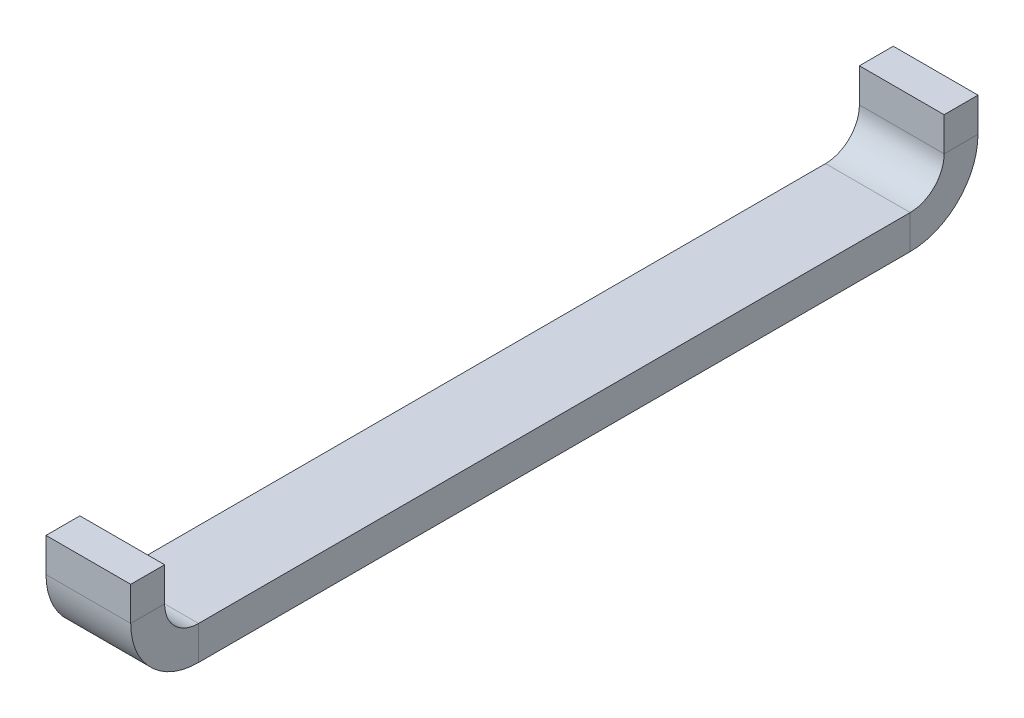
ISO-10303-21;
HEADER;
FILE_DESCRIPTION(('STEP AP214'),'2;1');
FILE_NAME('part.step','',(''),(''),'','','');
FILE_SCHEMA(('AUTOMOTIVE_DESIGN { 1 0 10303 214 1 1 1 1 }'));
ENDSEC;
DATA;
#1=APPLICATION_CONTEXT('core data for automotive mechanical design processes');
#2=APPLICATION_PROTOCOL_DEFINITION('international standard','automotive_design',2000,#1);
#3=PRODUCT_CONTEXT('',#1,'mechanical');
#4=PRODUCT('Part','Part','',(#3));
#5=PRODUCT_RELATED_PRODUCT_CATEGORY('part','',(#4));
#6=PRODUCT_DEFINITION_FORMATION('','',#4);
#7=PRODUCT_DEFINITION_CONTEXT('part definition',#1,'design');
#8=PRODUCT_DEFINITION('design','',#6,#7);
#9=PRODUCT_DEFINITION_SHAPE('','',#8);
#10=(LENGTH_UNIT() NAMED_UNIT(*) SI_UNIT(.MILLI.,.METRE.));
#11=(NAMED_UNIT(*) PLANE_ANGLE_UNIT() SI_UNIT($,.RADIAN.));
#12=(NAMED_UNIT(*) SI_UNIT($,.STERADIAN.) SOLID_ANGLE_UNIT());
#13=UNCERTAINTY_MEASURE_WITH_UNIT(LENGTH_MEASURE(1.E-05),#10,'distance_accuracy_value','');
#14=(GEOMETRIC_REPRESENTATION_CONTEXT(3) GLOBAL_UNCERTAINTY_ASSIGNED_CONTEXT((#13)) GLOBAL_UNIT_ASSIGNED_CONTEXT((#10,
#11,#12)) REPRESENTATION_CONTEXT('',''));
#15=CARTESIAN_POINT('',(0.,0.,0.));
#16=DIRECTION('',(0.,0.,1.));
#17=DIRECTION('',(1.,0.,0.));
#18=AXIS2_PLACEMENT_3D('',#15,#16,#17);
#19=CARTESIAN_POINT('',(0.,-2.,0.));
#20=DIRECTION('',(0.,-1.,0.));
#21=DIRECTION('',(0.,0.,-1.));
#22=AXIS2_PLACEMENT_3D('',#19,#20,#21);
#23=PLANE('',#22);
#24=DIRECTION('',(0.,0.,1.));
#25=VECTOR('',#24,1.);
#26=CARTESIAN_POINT('',(0.,-2.,0.));
#27=LINE('',#26,#25);
#28=CARTESIAN_POINT('',(0.,-2.00000000000002,-46.));
#29=VERTEX_POINT('',#28);
#30=CARTESIAN_POINT('',(0.,-2.,-4.));
#31=VERTEX_POINT('',#30);
#32=EDGE_CURVE('E84',#29,#31,#27,.T.);
#33=ORIENTED_EDGE('',*,*,#32,.F.);
#34=DIRECTION('',(-1.,0.,0.));
#35=VECTOR('',#34,1.);
#36=CARTESIAN_POINT('',(0.,-2.00000000000002,-46.));
#37=LINE('',#36,#35);
#38=CARTESIAN_POINT('',(5.,-2.,-46.));
#39=VERTEX_POINT('',#38);
#40=EDGE_CURVE('E207',#29,#39,#37,.F.);
#41=ORIENTED_EDGE('',*,*,#40,.T.);
#42=DIRECTION('',(0.,0.,-1.));
#43=VECTOR('',#42,1.);
#44=CARTESIAN_POINT('',(5.,-2.,0.));
#45=LINE('',#44,#43);
#46=CARTESIAN_POINT('',(5.,-2.00000000000001,-4.));
#47=VERTEX_POINT('',#46);
#48=EDGE_CURVE('E13',#47,#39,#45,.T.);
#49=ORIENTED_EDGE('',*,*,#48,.F.);
#50=DIRECTION('',(1.,0.,0.));
#51=VECTOR('',#50,1.);
#52=CARTESIAN_POINT('',(5.,-2.00000000000001,-4.));
#53=LINE('',#52,#51);
#54=EDGE_CURVE('E258',#47,#31,#53,.F.);
#55=ORIENTED_EDGE('',*,*,#54,.T.);
#56=EDGE_LOOP('',(#33,#41,#49,#55));
#57=FACE_BOUND('',#56,.T.);
#58=ADVANCED_FACE('F75',(#57),#23,.T.);
#59=CARTESIAN_POINT('',(0.,0.,0.));
#60=DIRECTION('',(0.,-1.,0.));
#61=DIRECTION('',(0.,0.,-1.));
#62=AXIS2_PLACEMENT_3D('',#59,#60,#61);
#63=PLANE('',#62);
#64=DIRECTION('',(-1.,0.,0.));
#65=VECTOR('',#64,1.);
#66=CARTESIAN_POINT('',(0.,0.,-46.));
#67=LINE('',#66,#65);
#68=CARTESIAN_POINT('',(0.,0.,-46.));
#69=VERTEX_POINT('',#68);
#70=CARTESIAN_POINT('',(5.,0.,-46.));
#71=VERTEX_POINT('',#70);
#72=EDGE_CURVE('E218',#69,#71,#67,.F.);
#73=ORIENTED_EDGE('',*,*,#72,.F.);
#74=DIRECTION('',(0.,0.,1.));
#75=VECTOR('',#74,1.);
#76=CARTESIAN_POINT('',(0.,0.,0.));
#77=LINE('',#76,#75);
#78=CARTESIAN_POINT('',(0.,0.,-4.));
#79=VERTEX_POINT('',#78);
#80=EDGE_CURVE('E275',#69,#79,#77,.T.);
#81=ORIENTED_EDGE('',*,*,#80,.T.);
#82=DIRECTION('',(1.,0.,0.));
#83=VECTOR('',#82,1.);
#84=CARTESIAN_POINT('',(5.,0.,-4.));
#85=LINE('',#84,#83);
#86=CARTESIAN_POINT('',(5.,0.,-4.));
#87=VERTEX_POINT('',#86);
#88=EDGE_CURVE('E269',#87,#79,#85,.F.);
#89=ORIENTED_EDGE('',*,*,#88,.F.);
#90=DIRECTION('',(0.,0.,-1.));
#91=VECTOR('',#90,1.);
#92=CARTESIAN_POINT('',(5.,0.,0.));
#93=LINE('',#92,#91);
#94=EDGE_CURVE('E79',#87,#71,#93,.T.);
#95=ORIENTED_EDGE('',*,*,#94,.T.);
#96=EDGE_LOOP('',(#73,#81,#89,#95));
#97=FACE_BOUND('',#96,.T.);
#98=ADVANCED_FACE('F287',(#97),#63,.F.);
#99=CARTESIAN_POINT('',(0.,-2.,0.));
#100=DIRECTION('',(-1.,0.,0.));
#101=DIRECTION('',(0.,0.,1.));
#102=AXIS2_PLACEMENT_3D('',#99,#100,#101);
#103=PLANE('',#102);
#104=ORIENTED_EDGE('',*,*,#80,.F.);
#105=DIRECTION('',(0.,-1.,0.));
#106=VECTOR('',#105,1.);
#107=CARTESIAN_POINT('',(0.,0.,-46.));
#108=LINE('',#107,#106);
#109=EDGE_CURVE('E212',#69,#29,#108,.T.);
#110=ORIENTED_EDGE('',*,*,#109,.T.);
#111=ORIENTED_EDGE('',*,*,#32,.T.);
#112=DIRECTION('',(0.,-1.,0.));
#113=VECTOR('',#112,1.);
#114=CARTESIAN_POINT('',(0.,0.,-4.));
#115=LINE('',#114,#113);
#116=EDGE_CURVE('E273',#79,#31,#115,.T.);
#117=ORIENTED_EDGE('',*,*,#116,.F.);
#118=EDGE_LOOP('',(#104,#110,#111,#117));
#119=FACE_BOUND('',#118,.T.);
#120=ADVANCED_FACE('F77',(#119),#103,.T.);
#121=CARTESIAN_POINT('',(5.,-2.,0.));
#122=DIRECTION('',(1.,0.,0.));
#123=DIRECTION('',(0.,0.,-1.));
#124=AXIS2_PLACEMENT_3D('',#121,#122,#123);
#125=PLANE('',#124);
#126=DIRECTION('',(0.,-1.,0.));
#127=VECTOR('',#126,1.);
#128=CARTESIAN_POINT('',(5.,0.,-46.));
#129=LINE('',#128,#127);
#130=EDGE_CURVE('E223',#71,#39,#129,.T.);
#131=ORIENTED_EDGE('',*,*,#130,.F.);
#132=ORIENTED_EDGE('',*,*,#94,.F.);
#133=DIRECTION('',(0.,-1.,0.));
#134=VECTOR('',#133,1.);
#135=CARTESIAN_POINT('',(5.,0.,-4.));
#136=LINE('',#135,#134);
#137=EDGE_CURVE('E263',#87,#47,#136,.T.);
#138=ORIENTED_EDGE('',*,*,#137,.T.);
#139=ORIENTED_EDGE('',*,*,#48,.T.);
#140=EDGE_LOOP('',(#131,#132,#138,#139));
#141=FACE_BOUND('',#140,.T.);
#142=ADVANCED_FACE('F290',(#141),#125,.T.);
#143=CARTESIAN_POINT('',(0.,1.99999999999999,-4.));
#144=DIRECTION('',(-1.,0.,0.));
#145=DIRECTION('',(0.,0.,1.));
#146=AXIS2_PLACEMENT_3D('',#143,#144,#145);
#147=PLANE('',#146);
#148=DIRECTION('',(0.,0.,-1.));
#149=VECTOR('',#148,1.);
#150=CARTESIAN_POINT('',(0.,1.99999999999999,0.));
#151=LINE('',#150,#149);
#152=CARTESIAN_POINT('',(0.,1.99999999999999,-2.));
#153=VERTEX_POINT('',#152);
#154=CARTESIAN_POINT('',(0.,1.99999999999999,0.));
#155=VERTEX_POINT('',#154);
#156=EDGE_CURVE('E225',#153,#155,#151,.F.);
#157=ORIENTED_EDGE('',*,*,#156,.F.);
#158=CARTESIAN_POINT('',(0.,1.99999999999999,-4.));
#159=DIRECTION('',(1.,0.,0.));
#160=DIRECTION('',(0.,0.,-1.));
#161=AXIS2_PLACEMENT_3D('',#158,#159,#160);
#162=CIRCLE('',#161,2.);
#163=EDGE_CURVE('E266',#79,#153,#162,.F.);
#164=ORIENTED_EDGE('',*,*,#163,.F.);
#165=ORIENTED_EDGE('',*,*,#116,.T.);
#166=CARTESIAN_POINT('',(0.,1.99999999999999,-4.));
#167=DIRECTION('',(1.,0.,0.));
#168=DIRECTION('',(0.,0.,-1.));
#169=AXIS2_PLACEMENT_3D('',#166,#167,#168);
#170=CIRCLE('',#169,4.);
#171=EDGE_CURVE('E92',#31,#155,#170,.F.);
#172=ORIENTED_EDGE('',*,*,#171,.T.);
#173=EDGE_LOOP('',(#157,#164,#165,#172));
#174=FACE_BOUND('',#173,.T.);
#175=ADVANCED_FACE('F305',(#174),#147,.T.);
#176=CARTESIAN_POINT('',(5.,1.99999999999999,-4.));
#177=DIRECTION('',(-1.,0.,0.));
#178=DIRECTION('',(0.,0.,1.));
#179=AXIS2_PLACEMENT_3D('',#176,#177,#178);
#180=PLANE('',#179);
#181=CARTESIAN_POINT('',(5.,1.99999999999999,-4.));
#182=DIRECTION('',(1.,0.,0.));
#183=DIRECTION('',(0.,0.,-1.));
#184=AXIS2_PLACEMENT_3D('',#181,#182,#183);
#185=CIRCLE('',#184,2.);
#186=CARTESIAN_POINT('',(5.,1.99999999999999,-2.));
#187=VERTEX_POINT('',#186);
#188=EDGE_CURVE('E231',#187,#87,#185,.T.);
#189=ORIENTED_EDGE('',*,*,#188,.F.);
#190=DIRECTION('',(0.,0.,-1.));
#191=VECTOR('',#190,1.);
#192=CARTESIAN_POINT('',(5.,1.99999999999999,-1.99999999999999));
#193=LINE('',#192,#191);
#194=CARTESIAN_POINT('',(5.,1.99999999999999,0.));
#195=VERTEX_POINT('',#194);
#196=EDGE_CURVE('E251',#187,#195,#193,.F.);
#197=ORIENTED_EDGE('',*,*,#196,.T.);
#198=CARTESIAN_POINT('',(5.,1.99999999999999,-4.));
#199=DIRECTION('',(1.,0.,0.));
#200=DIRECTION('',(0.,0.,-1.));
#201=AXIS2_PLACEMENT_3D('',#198,#199,#200);
#202=CIRCLE('',#201,4.);
#203=EDGE_CURVE('E261',#195,#47,#202,.T.);
#204=ORIENTED_EDGE('',*,*,#203,.T.);
#205=ORIENTED_EDGE('',*,*,#137,.F.);
#206=EDGE_LOOP('',(#189,#197,#204,#205));
#207=FACE_BOUND('',#206,.T.);
#208=ADVANCED_FACE('F329',(#207),#180,.F.);
#209=CARTESIAN_POINT('',(5.,1.99999999999999,-4.));
#210=DIRECTION('',(1.,0.,0.));
#211=DIRECTION('',(0.,0.,1.));
#212=AXIS2_PLACEMENT_3D('',#209,#210,#211);
#213=CYLINDRICAL_SURFACE('',#212,4.);
#214=ORIENTED_EDGE('',*,*,#54,.F.);
#215=ORIENTED_EDGE('',*,*,#203,.F.);
#216=DIRECTION('',(1.,0.,0.));
#217=VECTOR('',#216,1.);
#218=CARTESIAN_POINT('',(0.,1.99999999999999,0.));
#219=LINE('',#218,#217);
#220=EDGE_CURVE('E249',#195,#155,#219,.F.);
#221=ORIENTED_EDGE('',*,*,#220,.T.);
#222=ORIENTED_EDGE('',*,*,#171,.F.);
#223=EDGE_LOOP('',(#214,#215,#221,#222));
#224=FACE_BOUND('',#223,.T.);
#225=ADVANCED_FACE('F332',(#224),#213,.T.);
#226=CARTESIAN_POINT('',(5.,1.99999999999999,-4.));
#227=DIRECTION('',(1.,0.,0.));
#228=DIRECTION('',(0.,0.,1.));
#229=AXIS2_PLACEMENT_3D('',#226,#227,#228);
#230=CYLINDRICAL_SURFACE('',#229,2.);
#231=ORIENTED_EDGE('',*,*,#88,.T.);
#232=ORIENTED_EDGE('',*,*,#163,.T.);
#233=DIRECTION('',(1.,0.,0.));
#234=VECTOR('',#233,1.);
#235=CARTESIAN_POINT('',(0.,1.99999999999999,-2.));
#236=LINE('',#235,#234);
#237=EDGE_CURVE('E254',#153,#187,#236,.T.);
#238=ORIENTED_EDGE('',*,*,#237,.T.);
#239=ORIENTED_EDGE('',*,*,#188,.T.);
#240=EDGE_LOOP('',(#231,#232,#238,#239));
#241=FACE_BOUND('',#240,.T.);
#242=ADVANCED_FACE('F308',(#241),#230,.F.);
#243=CARTESIAN_POINT('',(0.,0.,0.));
#244=DIRECTION('',(1.,0.,0.));
#245=DIRECTION('',(0.,0.,-1.));
#246=AXIS2_PLACEMENT_3D('',#243,#244,#245);
#247=PLANE('',#246);
#248=ORIENTED_EDGE('',*,*,#156,.T.);
#249=DIRECTION('',(0.,-1.,0.));
#250=VECTOR('',#249,1.);
#251=CARTESIAN_POINT('',(0.,0.,0.));
#252=LINE('',#251,#250);
#253=CARTESIAN_POINT('',(0.,4.00000000000001,0.));
#254=VERTEX_POINT('',#253);
#255=EDGE_CURVE('E239',#254,#155,#252,.T.);
#256=ORIENTED_EDGE('',*,*,#255,.F.);
#257=DIRECTION('',(0.,0.,-1.));
#258=VECTOR('',#257,1.);
#259=CARTESIAN_POINT('',(0.,4.00000000000001,0.));
#260=LINE('',#259,#258);
#261=CARTESIAN_POINT('',(0.,4.00000000000001,-2.));
#262=VERTEX_POINT('',#261);
#263=EDGE_CURVE('E232',#254,#262,#260,.T.);
#264=ORIENTED_EDGE('',*,*,#263,.T.);
#265=DIRECTION('',(0.,1.,0.));
#266=VECTOR('',#265,1.);
#267=CARTESIAN_POINT('',(0.,0.,-2.));
#268=LINE('',#267,#266);
#269=EDGE_CURVE('E246',#262,#153,#268,.F.);
#270=ORIENTED_EDGE('',*,*,#269,.T.);
#271=EDGE_LOOP('',(#248,#256,#264,#270));
#272=FACE_BOUND('',#271,.T.);
#273=ADVANCED_FACE('F316',(#272),#247,.F.);
#274=CARTESIAN_POINT('',(5.,4.00000000000001,0.));
#275=DIRECTION('',(-1.,0.,0.));
#276=DIRECTION('',(0.,0.,1.));
#277=AXIS2_PLACEMENT_3D('',#274,#275,#276);
#278=PLANE('',#277);
#279=ORIENTED_EDGE('',*,*,#196,.F.);
#280=DIRECTION('',(0.,-1.,0.));
#281=VECTOR('',#280,1.);
#282=CARTESIAN_POINT('',(5.,4.00000000000001,-2.));
#283=LINE('',#282,#281);
#284=CARTESIAN_POINT('',(5.,4.00000000000001,-2.));
#285=VERTEX_POINT('',#284);
#286=EDGE_CURVE('E244',#187,#285,#283,.F.);
#287=ORIENTED_EDGE('',*,*,#286,.T.);
#288=DIRECTION('',(0.,0.,-1.));
#289=VECTOR('',#288,1.);
#290=CARTESIAN_POINT('',(5.,4.00000000000001,0.));
#291=LINE('',#290,#289);
#292=CARTESIAN_POINT('',(5.,4.00000000000001,0.));
#293=VERTEX_POINT('',#292);
#294=EDGE_CURVE('E228',#293,#285,#291,.T.);
#295=ORIENTED_EDGE('',*,*,#294,.F.);
#296=DIRECTION('',(0.,1.,0.));
#297=VECTOR('',#296,1.);
#298=CARTESIAN_POINT('',(5.,0.,0.));
#299=LINE('',#298,#297);
#300=EDGE_CURVE('E237',#195,#293,#299,.T.);
#301=ORIENTED_EDGE('',*,*,#300,.F.);
#302=EDGE_LOOP('',(#279,#287,#295,#301));
#303=FACE_BOUND('',#302,.T.);
#304=ADVANCED_FACE('F326',(#303),#278,.F.);
#305=CARTESIAN_POINT('',(0.,0.,0.));
#306=DIRECTION('',(0.,0.,-1.));
#307=DIRECTION('',(-1.,0.,0.));
#308=AXIS2_PLACEMENT_3D('',#305,#306,#307);
#309=PLANE('',#308);
#310=ORIENTED_EDGE('',*,*,#220,.F.);
#311=ORIENTED_EDGE('',*,*,#300,.T.);
#312=DIRECTION('',(-1.,0.,0.));
#313=VECTOR('',#312,1.);
#314=CARTESIAN_POINT('',(0.,4.00000000000001,0.));
#315=LINE('',#314,#313);
#316=EDGE_CURVE('E235',#293,#254,#315,.T.);
#317=ORIENTED_EDGE('',*,*,#316,.T.);
#318=ORIENTED_EDGE('',*,*,#255,.T.);
#319=EDGE_LOOP('',(#310,#311,#317,#318));
#320=FACE_BOUND('',#319,.T.);
#321=ADVANCED_FACE('F331',(#320),#309,.F.);
#322=CARTESIAN_POINT('',(0.,0.,-2.));
#323=DIRECTION('',(0.,0.,-1.));
#324=DIRECTION('',(-1.,0.,0.));
#325=AXIS2_PLACEMENT_3D('',#322,#323,#324);
#326=PLANE('',#325);
#327=ORIENTED_EDGE('',*,*,#286,.F.);
#328=ORIENTED_EDGE('',*,*,#237,.F.);
#329=ORIENTED_EDGE('',*,*,#269,.F.);
#330=DIRECTION('',(1.,0.,0.));
#331=VECTOR('',#330,1.);
#332=CARTESIAN_POINT('',(0.,4.00000000000001,-2.));
#333=LINE('',#332,#331);
#334=EDGE_CURVE('E242',#285,#262,#333,.F.);
#335=ORIENTED_EDGE('',*,*,#334,.F.);
#336=EDGE_LOOP('',(#327,#328,#329,#335));
#337=FACE_BOUND('',#336,.T.);
#338=ADVANCED_FACE('F313',(#337),#326,.T.);
#339=CARTESIAN_POINT('',(0.,4.00000000000001,0.));
#340=DIRECTION('',(0.,-1.,0.));
#341=DIRECTION('',(0.,0.,-1.));
#342=AXIS2_PLACEMENT_3D('',#339,#340,#341);
#343=PLANE('',#342);
#344=ORIENTED_EDGE('',*,*,#334,.T.);
#345=ORIENTED_EDGE('',*,*,#263,.F.);
#346=ORIENTED_EDGE('',*,*,#316,.F.);
#347=ORIENTED_EDGE('',*,*,#294,.T.);
#348=EDGE_LOOP('',(#344,#345,#346,#347));
#349=FACE_BOUND('',#348,.T.);
#350=ADVANCED_FACE('F321',(#349),#343,.F.);
#351=CARTESIAN_POINT('',(5.,1.99999999999998,-46.));
#352=DIRECTION('',(1.,0.,0.));
#353=DIRECTION('',(0.,0.,-1.));
#354=AXIS2_PLACEMENT_3D('',#351,#352,#353);
#355=PLANE('',#354);
#356=DIRECTION('',(0.,0.,1.));
#357=VECTOR('',#356,1.);
#358=CARTESIAN_POINT('',(5.,2.00000000000001,-50.));
#359=LINE('',#358,#357);
#360=CARTESIAN_POINT('',(5.,1.99999999999997,-48.));
#361=VERTEX_POINT('',#360);
#362=CARTESIAN_POINT('',(5.,1.99999999999997,-50.));
#363=VERTEX_POINT('',#362);
#364=EDGE_CURVE('E190',#361,#363,#359,.F.);
#365=ORIENTED_EDGE('',*,*,#364,.F.);
#366=CARTESIAN_POINT('',(5.,1.99999999999998,-46.));
#367=DIRECTION('',(-1.,0.,0.));
#368=DIRECTION('',(0.,0.,1.));
#369=AXIS2_PLACEMENT_3D('',#366,#367,#368);
#370=CIRCLE('',#369,2.);
#371=EDGE_CURVE('E215',#71,#361,#370,.F.);
#372=ORIENTED_EDGE('',*,*,#371,.F.);
#373=ORIENTED_EDGE('',*,*,#130,.T.);
#374=CARTESIAN_POINT('',(5.,1.99999999999998,-46.));
#375=DIRECTION('',(-1.,0.,0.));
#376=DIRECTION('',(0.,0.,1.));
#377=AXIS2_PLACEMENT_3D('',#374,#375,#376);
#378=CIRCLE('',#377,4.);
#379=EDGE_CURVE('E100',#39,#363,#378,.F.);
#380=ORIENTED_EDGE('',*,*,#379,.T.);
#381=EDGE_LOOP('',(#365,#372,#373,#380));
#382=FACE_BOUND('',#381,.T.);
#383=ADVANCED_FACE('F294',(#382),#355,.T.);
#384=CARTESIAN_POINT('',(0.,1.99999999999998,-46.));
#385=DIRECTION('',(1.,0.,0.));
#386=DIRECTION('',(0.,0.,-1.));
#387=AXIS2_PLACEMENT_3D('',#384,#385,#386);
#388=PLANE('',#387);
#389=CARTESIAN_POINT('',(0.,1.99999999999998,-46.));
#390=DIRECTION('',(-1.,0.,0.));
#391=DIRECTION('',(0.,0.,1.));
#392=AXIS2_PLACEMENT_3D('',#389,#390,#391);
#393=CIRCLE('',#392,2.);
#394=CARTESIAN_POINT('',(0.,1.99999999999997,-48.));
#395=VERTEX_POINT('',#394);
#396=EDGE_CURVE('E220',#395,#69,#393,.T.);
#397=ORIENTED_EDGE('',*,*,#396,.F.);
#398=DIRECTION('',(0.,0.,1.));
#399=VECTOR('',#398,1.);
#400=CARTESIAN_POINT('',(0.,1.99999999999999,-48.));
#401=LINE('',#400,#399);
#402=CARTESIAN_POINT('',(0.,2.00000000000001,-50.));
#403=VERTEX_POINT('',#402);
#404=EDGE_CURVE('E201',#395,#403,#401,.F.);
#405=ORIENTED_EDGE('',*,*,#404,.T.);
#406=CARTESIAN_POINT('',(0.,1.99999999999998,-46.));
#407=DIRECTION('',(-1.,0.,0.));
#408=DIRECTION('',(0.,0.,1.));
#409=AXIS2_PLACEMENT_3D('',#406,#407,#408);
#410=CIRCLE('',#409,4.);
#411=EDGE_CURVE('E210',#403,#29,#410,.T.);
#412=ORIENTED_EDGE('',*,*,#411,.T.);
#413=ORIENTED_EDGE('',*,*,#109,.F.);
#414=EDGE_LOOP('',(#397,#405,#412,#413));
#415=FACE_BOUND('',#414,.T.);
#416=ADVANCED_FACE('F300',(#415),#388,.F.);
#417=CARTESIAN_POINT('',(0.,1.99999999999998,-46.));
#418=DIRECTION('',(-1.,0.,0.));
#419=DIRECTION('',(0.,0.,-1.));
#420=AXIS2_PLACEMENT_3D('',#417,#418,#419);
#421=CYLINDRICAL_SURFACE('',#420,4.);
#422=ORIENTED_EDGE('',*,*,#40,.F.);
#423=ORIENTED_EDGE('',*,*,#411,.F.);
#424=DIRECTION('',(-1.,0.,0.));
#425=VECTOR('',#424,1.);
#426=CARTESIAN_POINT('',(5.,2.00000000000001,-50.));
#427=LINE('',#426,#425);
#428=EDGE_CURVE('E199',#403,#363,#427,.F.);
#429=ORIENTED_EDGE('',*,*,#428,.T.);
#430=ORIENTED_EDGE('',*,*,#379,.F.);
#431=EDGE_LOOP('',(#422,#423,#429,#430));
#432=FACE_BOUND('',#431,.T.);
#433=ADVANCED_FACE('F297',(#432),#421,.T.);
#434=CARTESIAN_POINT('',(0.,1.99999999999998,-46.));
#435=DIRECTION('',(-1.,0.,0.));
#436=DIRECTION('',(0.,0.,-1.));
#437=AXIS2_PLACEMENT_3D('',#434,#435,#436);
#438=CYLINDRICAL_SURFACE('',#437,2.);
#439=ORIENTED_EDGE('',*,*,#72,.T.);
#440=ORIENTED_EDGE('',*,*,#371,.T.);
#441=DIRECTION('',(-1.,0.,0.));
#442=VECTOR('',#441,1.);
#443=CARTESIAN_POINT('',(5.,1.99999999999999,-48.));
#444=LINE('',#443,#442);
#445=EDGE_CURVE('E204',#361,#395,#444,.T.);
#446=ORIENTED_EDGE('',*,*,#445,.T.);
#447=ORIENTED_EDGE('',*,*,#396,.T.);
#448=EDGE_LOOP('',(#439,#440,#446,#447));
#449=FACE_BOUND('',#448,.T.);
#450=ADVANCED_FACE('F468',(#449),#438,.F.);
#451=CARTESIAN_POINT('',(5.,0.,-50.));
#452=DIRECTION('',(-1.,0.,0.));
#453=DIRECTION('',(0.,0.,1.));
#454=AXIS2_PLACEMENT_3D('',#451,#452,#453);
#455=PLANE('',#454);
#456=ORIENTED_EDGE('',*,*,#364,.T.);
#457=DIRECTION('',(0.,-1.,0.));
#458=VECTOR('',#457,1.);
#459=CARTESIAN_POINT('',(5.,-1.80455314319899E-13,-50.));
#460=LINE('',#459,#458);
#461=CARTESIAN_POINT('',(5.,4.,-50.));
#462=VERTEX_POINT('',#461);
#463=EDGE_CURVE('E171',#462,#363,#460,.T.);
#464=ORIENTED_EDGE('',*,*,#463,.F.);
#465=DIRECTION('',(0.,0.,1.));
#466=VECTOR('',#465,1.);
#467=CARTESIAN_POINT('',(5.,4.,-50.));
#468=LINE('',#467,#466);
#469=CARTESIAN_POINT('',(5.,4.00000000000001,-48.));
#470=VERTEX_POINT('',#469);
#471=EDGE_CURVE('E177',#462,#470,#468,.T.);
#472=ORIENTED_EDGE('',*,*,#471,.T.);
#473=DIRECTION('',(0.,1.,0.));
#474=VECTOR('',#473,1.);
#475=CARTESIAN_POINT('',(5.,0.,-48.));
#476=LINE('',#475,#474);
#477=EDGE_CURVE('E197',#470,#361,#476,.F.);
#478=ORIENTED_EDGE('',*,*,#477,.T.);
#479=EDGE_LOOP('',(#456,#464,#472,#478));
#480=FACE_BOUND('',#479,.T.);
#481=ADVANCED_FACE('F189',(#480),#455,.F.);
#482=CARTESIAN_POINT('',(0.,4.,-50.));
#483=DIRECTION('',(1.,0.,0.));
#484=DIRECTION('',(0.,0.,-1.));
#485=AXIS2_PLACEMENT_3D('',#482,#483,#484);
#486=PLANE('',#485);
#487=ORIENTED_EDGE('',*,*,#404,.F.);
#488=DIRECTION('',(0.,-1.,0.));
#489=VECTOR('',#488,1.);
#490=CARTESIAN_POINT('',(0.,4.00000000000001,-48.));
#491=LINE('',#490,#489);
#492=CARTESIAN_POINT('',(0.,4.00000000000001,-48.));
#493=VERTEX_POINT('',#492);
#494=EDGE_CURVE('E193',#395,#493,#491,.F.);
#495=ORIENTED_EDGE('',*,*,#494,.T.);
#496=DIRECTION('',(0.,0.,1.));
#497=VECTOR('',#496,1.);
#498=CARTESIAN_POINT('',(0.,4.,-50.));
#499=LINE('',#498,#497);
#500=CARTESIAN_POINT('',(0.,4.,-50.));
#501=VERTEX_POINT('',#500);
#502=EDGE_CURVE('E186',#501,#493,#499,.T.);
#503=ORIENTED_EDGE('',*,*,#502,.F.);
#504=DIRECTION('',(0.,1.,0.));
#505=VECTOR('',#504,1.);
#506=CARTESIAN_POINT('',(0.,-1.80455314319899E-13,-50.));
#507=LINE('',#506,#505);
#508=EDGE_CURVE('E173',#403,#501,#507,.T.);
#509=ORIENTED_EDGE('',*,*,#508,.F.);
#510=EDGE_LOOP('',(#487,#495,#503,#509));
#511=FACE_BOUND('',#510,.T.);
#512=ADVANCED_FACE('F488',(#511),#486,.F.);
#513=CARTESIAN_POINT('',(0.,-1.80455314319899E-13,-50.));
#514=DIRECTION('',(0.,0.,1.));
#515=DIRECTION('',(0.,-1.,0.));
#516=AXIS2_PLACEMENT_3D('',#513,#514,#515);
#517=PLANE('',#516);
#518=ORIENTED_EDGE('',*,*,#428,.F.);
#519=ORIENTED_EDGE('',*,*,#508,.T.);
#520=DIRECTION('',(1.,0.,0.));
#521=VECTOR('',#520,1.);
#522=CARTESIAN_POINT('',(0.,4.,-50.));
#523=LINE('',#522,#521);
#524=EDGE_CURVE('E166',#501,#462,#523,.T.);
#525=ORIENTED_EDGE('',*,*,#524,.T.);
#526=ORIENTED_EDGE('',*,*,#463,.T.);
#527=EDGE_LOOP('',(#518,#519,#525,#526));
#528=FACE_BOUND('',#527,.T.);
#529=ADVANCED_FACE('F169',(#528),#517,.F.);
#530=CARTESIAN_POINT('',(0.,-1.7347234759768E-13,-48.));
#531=DIRECTION('',(0.,0.,1.));
#532=DIRECTION('',(0.,-1.,0.));
#533=AXIS2_PLACEMENT_3D('',#530,#531,#532);
#534=PLANE('',#533);
#535=ORIENTED_EDGE('',*,*,#494,.F.);
#536=ORIENTED_EDGE('',*,*,#445,.F.);
#537=ORIENTED_EDGE('',*,*,#477,.F.);
#538=DIRECTION('',(-1.,0.,0.));
#539=VECTOR('',#538,1.);
#540=CARTESIAN_POINT('',(5.,4.00000000000001,-48.));
#541=LINE('',#540,#539);
#542=EDGE_CURVE('E182',#493,#470,#541,.F.);
#543=ORIENTED_EDGE('',*,*,#542,.F.);
#544=EDGE_LOOP('',(#535,#536,#537,#543));
#545=FACE_BOUND('',#544,.T.);
#546=ADVANCED_FACE('F508',(#545),#534,.T.);
#547=CARTESIAN_POINT('',(5.,4.,-50.));
#548=DIRECTION('',(0.,-1.,0.));
#549=DIRECTION('',(0.,0.,-1.));
#550=AXIS2_PLACEMENT_3D('',#547,#548,#549);
#551=PLANE('',#550);
#552=ORIENTED_EDGE('',*,*,#542,.T.);
#553=ORIENTED_EDGE('',*,*,#471,.F.);
#554=ORIENTED_EDGE('',*,*,#524,.F.);
#555=ORIENTED_EDGE('',*,*,#502,.T.);
#556=EDGE_LOOP('',(#552,#553,#554,#555));
#557=FACE_BOUND('',#556,.T.);
#558=ADVANCED_FACE('F180',(#557),#551,.F.);
#559=CLOSED_SHELL('',(#58,#98,#120,#142,#175,#208,#225,#242,#273,#304,#321,#338,#350,#383,#416,
#433,#450,#481,#512,#529,#546,#558));
#560=MANIFOLD_SOLID_BREP('B2',#559);
#561=ADVANCED_BREP_SHAPE_REPRESENTATION('',(#18,#560),#14);
#562=SHAPE_DEFINITION_REPRESENTATION(#9,#561);
ENDSEC;
END-ISO-10303-21;
